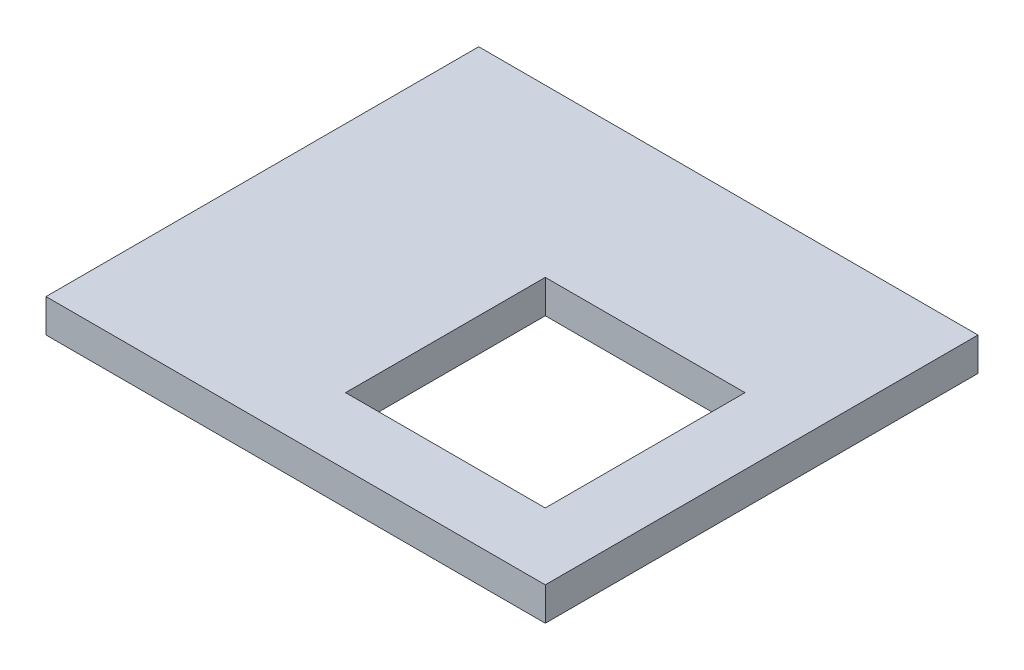
ISO-10303-21;
HEADER;
FILE_DESCRIPTION(('STEP AP214'),'2;1');
FILE_NAME('part.step','',(''),(''),'','','');
FILE_SCHEMA(('AUTOMOTIVE_DESIGN { 1 0 10303 214 1 1 1 1 }'));
ENDSEC;
DATA;
#1=APPLICATION_CONTEXT('core data for automotive mechanical design processes');
#2=APPLICATION_PROTOCOL_DEFINITION('international standard','automotive_design',2000,#1);
#3=PRODUCT_CONTEXT('',#1,'mechanical');
#4=PRODUCT('Part','Part','',(#3));
#5=PRODUCT_RELATED_PRODUCT_CATEGORY('part','',(#4));
#6=PRODUCT_DEFINITION_FORMATION('','',#4);
#7=PRODUCT_DEFINITION_CONTEXT('part definition',#1,'design');
#8=PRODUCT_DEFINITION('design','',#6,#7);
#9=PRODUCT_DEFINITION_SHAPE('','',#8);
#10=(LENGTH_UNIT() NAMED_UNIT(*) SI_UNIT(.MILLI.,.METRE.));
#11=(NAMED_UNIT(*) PLANE_ANGLE_UNIT() SI_UNIT($,.RADIAN.));
#12=(NAMED_UNIT(*) SI_UNIT($,.STERADIAN.) SOLID_ANGLE_UNIT());
#13=UNCERTAINTY_MEASURE_WITH_UNIT(LENGTH_MEASURE(1.E-05),#10,'distance_accuracy_value','');
#14=(GEOMETRIC_REPRESENTATION_CONTEXT(3) GLOBAL_UNCERTAINTY_ASSIGNED_CONTEXT((#13)) GLOBAL_UNIT_ASSIGNED_CONTEXT((#10,
#11,#12)) REPRESENTATION_CONTEXT('',''));
#15=CARTESIAN_POINT('',(0.,0.,0.));
#16=DIRECTION('',(0.,0.,1.));
#17=DIRECTION('',(1.,0.,0.));
#18=AXIS2_PLACEMENT_3D('',#15,#16,#17);
#19=CARTESIAN_POINT('',(0.,5.,0.));
#20=DIRECTION('',(0.,1.,0.));
#21=DIRECTION('',(0.,0.,1.));
#22=AXIS2_PLACEMENT_3D('',#19,#20,#21);
#23=PLANE('',#22);
#24=DIRECTION('',(0.,0.,1.));
#25=VECTOR('',#24,1.);
#26=CARTESIAN_POINT('',(-7.5,5.,6.5));
#27=LINE('',#26,#25);
#28=CARTESIAN_POINT('',(-7.5,5.,-6.5));
#29=VERTEX_POINT('',#28);
#30=CARTESIAN_POINT('',(-7.5,5.,6.5));
#31=VERTEX_POINT('',#30);
#32=EDGE_CURVE('E135',#29,#31,#27,.T.);
#33=ORIENTED_EDGE('',*,*,#32,.T.);
#34=DIRECTION('',(1.,0.,0.));
#35=VECTOR('',#34,1.);
#36=CARTESIAN_POINT('',(7.5,5.,6.5));
#37=LINE('',#36,#35);
#38=CARTESIAN_POINT('',(7.5,5.,6.5));
#39=VERTEX_POINT('',#38);
#40=EDGE_CURVE('E138',#31,#39,#37,.T.);
#41=ORIENTED_EDGE('',*,*,#40,.T.);
#42=DIRECTION('',(0.,0.,-1.));
#43=VECTOR('',#42,1.);
#44=CARTESIAN_POINT('',(7.5,5.,6.5));
#45=LINE('',#44,#43);
#46=CARTESIAN_POINT('',(7.5,5.,-6.5));
#47=VERTEX_POINT('',#46);
#48=EDGE_CURVE('E141',#39,#47,#45,.T.);
#49=ORIENTED_EDGE('',*,*,#48,.T.);
#50=DIRECTION('',(-1.,0.,0.));
#51=VECTOR('',#50,1.);
#52=CARTESIAN_POINT('',(7.5,5.,-6.5));
#53=LINE('',#52,#51);
#54=EDGE_CURVE('E143',#47,#29,#53,.T.);
#55=ORIENTED_EDGE('',*,*,#54,.T.);
#56=EDGE_LOOP('',(#33,#41,#49,#55));
#57=FACE_BOUND('',#56,.T.);
#58=DIRECTION('',(1.,0.,0.));
#59=VECTOR('',#58,1.);
#60=CARTESIAN_POINT('',(0.,5.,-1.5));
#61=LINE('',#60,#59);
#62=CARTESIAN_POINT('',(-0.500000000000001,5.,-1.5));
#63=VERTEX_POINT('',#62);
#64=CARTESIAN_POINT('',(5.5,5.,-1.5));
#65=VERTEX_POINT('',#64);
#66=EDGE_CURVE('E107',#63,#65,#61,.T.);
#67=ORIENTED_EDGE('',*,*,#66,.T.);
#68=DIRECTION('',(0.,0.,1.));
#69=VECTOR('',#68,1.);
#70=CARTESIAN_POINT('',(5.5,5.,0.));
#71=LINE('',#70,#69);
#72=CARTESIAN_POINT('',(5.5,5.,4.5));
#73=VERTEX_POINT('',#72);
#74=EDGE_CURVE('E48',#65,#73,#71,.T.);
#75=ORIENTED_EDGE('',*,*,#74,.T.);
#76=DIRECTION('',(-1.,0.,0.));
#77=VECTOR('',#76,1.);
#78=CARTESIAN_POINT('',(0.,5.,4.5));
#79=LINE('',#78,#77);
#80=CARTESIAN_POINT('',(-0.500000000000001,5.,4.5));
#81=VERTEX_POINT('',#80);
#82=EDGE_CURVE('E113',#73,#81,#79,.T.);
#83=ORIENTED_EDGE('',*,*,#82,.T.);
#84=DIRECTION('',(0.,0.,-1.));
#85=VECTOR('',#84,1.);
#86=CARTESIAN_POINT('',(-0.500000000000001,5.,0.));
#87=LINE('',#86,#85);
#88=EDGE_CURVE('E127',#81,#63,#87,.T.);
#89=ORIENTED_EDGE('',*,*,#88,.T.);
#90=EDGE_LOOP('',(#67,#75,#83,#89));
#91=FACE_BOUND('',#90,.T.);
#92=ADVANCED_FACE('F33',(#57,#91),#23,.T.);
#93=CARTESIAN_POINT('',(0.,4.,0.));
#94=DIRECTION('',(0.,1.,0.));
#95=DIRECTION('',(0.,0.,1.));
#96=AXIS2_PLACEMENT_3D('',#93,#94,#95);
#97=PLANE('',#96);
#98=DIRECTION('',(0.,0.,1.));
#99=VECTOR('',#98,1.);
#100=CARTESIAN_POINT('',(-7.5,4.,6.5));
#101=LINE('',#100,#99);
#102=CARTESIAN_POINT('',(-7.5,4.,-6.5));
#103=VERTEX_POINT('',#102);
#104=CARTESIAN_POINT('',(-7.5,4.,6.5));
#105=VERTEX_POINT('',#104);
#106=EDGE_CURVE('E114',#103,#105,#101,.T.);
#107=ORIENTED_EDGE('',*,*,#106,.F.);
#108=DIRECTION('',(-1.,0.,0.));
#109=VECTOR('',#108,1.);
#110=CARTESIAN_POINT('',(7.5,4.,-6.5));
#111=LINE('',#110,#109);
#112=CARTESIAN_POINT('',(7.5,4.,-6.5));
#113=VERTEX_POINT('',#112);
#114=EDGE_CURVE('E139',#113,#103,#111,.T.);
#115=ORIENTED_EDGE('',*,*,#114,.F.);
#116=DIRECTION('',(0.,0.,-1.));
#117=VECTOR('',#116,1.);
#118=CARTESIAN_POINT('',(7.5,4.,6.5));
#119=LINE('',#118,#117);
#120=CARTESIAN_POINT('',(7.5,4.,6.5));
#121=VERTEX_POINT('',#120);
#122=EDGE_CURVE('E150',#121,#113,#119,.T.);
#123=ORIENTED_EDGE('',*,*,#122,.F.);
#124=DIRECTION('',(1.,0.,0.));
#125=VECTOR('',#124,1.);
#126=CARTESIAN_POINT('',(7.5,4.,6.5));
#127=LINE('',#126,#125);
#128=EDGE_CURVE('E148',#105,#121,#127,.T.);
#129=ORIENTED_EDGE('',*,*,#128,.F.);
#130=EDGE_LOOP('',(#107,#115,#123,#129));
#131=FACE_BOUND('',#130,.T.);
#132=DIRECTION('',(0.,0.,1.));
#133=VECTOR('',#132,1.);
#134=CARTESIAN_POINT('',(5.5,4.,0.));
#135=LINE('',#134,#133);
#136=CARTESIAN_POINT('',(5.5,4.,-1.5));
#137=VERTEX_POINT('',#136);
#138=CARTESIAN_POINT('',(5.5,4.,4.5));
#139=VERTEX_POINT('',#138);
#140=EDGE_CURVE('E98',#137,#139,#135,.T.);
#141=ORIENTED_EDGE('',*,*,#140,.F.);
#142=DIRECTION('',(1.,0.,0.));
#143=VECTOR('',#142,1.);
#144=CARTESIAN_POINT('',(0.,4.,-1.5));
#145=LINE('',#144,#143);
#146=CARTESIAN_POINT('',(-0.500000000000001,4.,-1.5));
#147=VERTEX_POINT('',#146);
#148=EDGE_CURVE('E121',#147,#137,#145,.T.);
#149=ORIENTED_EDGE('',*,*,#148,.F.);
#150=DIRECTION('',(0.,0.,-1.));
#151=VECTOR('',#150,1.);
#152=CARTESIAN_POINT('',(-0.500000000000001,4.,0.));
#153=LINE('',#152,#151);
#154=CARTESIAN_POINT('',(-0.500000000000001,4.,4.5));
#155=VERTEX_POINT('',#154);
#156=EDGE_CURVE('E119',#155,#147,#153,.T.);
#157=ORIENTED_EDGE('',*,*,#156,.F.);
#158=DIRECTION('',(-1.,0.,0.));
#159=VECTOR('',#158,1.);
#160=CARTESIAN_POINT('',(0.,4.,4.5));
#161=LINE('',#160,#159);
#162=EDGE_CURVE('E106',#139,#155,#161,.T.);
#163=ORIENTED_EDGE('',*,*,#162,.F.);
#164=EDGE_LOOP('',(#141,#149,#157,#163));
#165=FACE_BOUND('',#164,.T.);
#166=ADVANCED_FACE('F118',(#131,#165),#97,.F.);
#167=CARTESIAN_POINT('',(-7.5,5.,6.5));
#168=DIRECTION('',(1.,0.,0.));
#169=DIRECTION('',(0.,0.,-1.));
#170=AXIS2_PLACEMENT_3D('',#167,#168,#169);
#171=PLANE('',#170);
#172=ORIENTED_EDGE('',*,*,#106,.T.);
#173=DIRECTION('',(0.,-1.,0.));
#174=VECTOR('',#173,1.);
#175=CARTESIAN_POINT('',(-7.5,5.,6.5));
#176=LINE('',#175,#174);
#177=EDGE_CURVE('E11',#31,#105,#176,.T.);
#178=ORIENTED_EDGE('',*,*,#177,.F.);
#179=ORIENTED_EDGE('',*,*,#32,.F.);
#180=DIRECTION('',(0.,-1.,0.));
#181=VECTOR('',#180,1.);
#182=CARTESIAN_POINT('',(-7.5,5.,-6.5));
#183=LINE('',#182,#181);
#184=EDGE_CURVE('E145',#29,#103,#183,.T.);
#185=ORIENTED_EDGE('',*,*,#184,.T.);
#186=EDGE_LOOP('',(#172,#178,#179,#185));
#187=FACE_BOUND('',#186,.T.);
#188=ADVANCED_FACE('F35',(#187),#171,.F.);
#189=CARTESIAN_POINT('',(7.5,5.,6.5));
#190=DIRECTION('',(0.,0.,-1.));
#191=DIRECTION('',(-1.,0.,0.));
#192=AXIS2_PLACEMENT_3D('',#189,#190,#191);
#193=PLANE('',#192);
#194=ORIENTED_EDGE('',*,*,#128,.T.);
#195=DIRECTION('',(0.,-1.,0.));
#196=VECTOR('',#195,1.);
#197=CARTESIAN_POINT('',(7.5,5.,6.5));
#198=LINE('',#197,#196);
#199=EDGE_CURVE('E41',#39,#121,#198,.T.);
#200=ORIENTED_EDGE('',*,*,#199,.F.);
#201=ORIENTED_EDGE('',*,*,#40,.F.);
#202=ORIENTED_EDGE('',*,*,#177,.T.);
#203=EDGE_LOOP('',(#194,#200,#201,#202));
#204=FACE_BOUND('',#203,.T.);
#205=ADVANCED_FACE('F177',(#204),#193,.F.);
#206=CARTESIAN_POINT('',(7.5,5.,6.5));
#207=DIRECTION('',(-1.,0.,0.));
#208=DIRECTION('',(0.,0.,1.));
#209=AXIS2_PLACEMENT_3D('',#206,#207,#208);
#210=PLANE('',#209);
#211=ORIENTED_EDGE('',*,*,#122,.T.);
#212=DIRECTION('',(0.,-1.,0.));
#213=VECTOR('',#212,1.);
#214=CARTESIAN_POINT('',(7.5,5.,-6.5));
#215=LINE('',#214,#213);
#216=EDGE_CURVE('E155',#47,#113,#215,.T.);
#217=ORIENTED_EDGE('',*,*,#216,.F.);
#218=ORIENTED_EDGE('',*,*,#48,.F.);
#219=ORIENTED_EDGE('',*,*,#199,.T.);
#220=EDGE_LOOP('',(#211,#217,#218,#219));
#221=FACE_BOUND('',#220,.T.);
#222=ADVANCED_FACE('F162',(#221),#210,.F.);
#223=CARTESIAN_POINT('',(7.5,5.,-6.5));
#224=DIRECTION('',(0.,0.,1.));
#225=DIRECTION('',(1.,0.,0.));
#226=AXIS2_PLACEMENT_3D('',#223,#224,#225);
#227=PLANE('',#226);
#228=ORIENTED_EDGE('',*,*,#114,.T.);
#229=ORIENTED_EDGE('',*,*,#184,.F.);
#230=ORIENTED_EDGE('',*,*,#54,.F.);
#231=ORIENTED_EDGE('',*,*,#216,.T.);
#232=EDGE_LOOP('',(#228,#229,#230,#231));
#233=FACE_BOUND('',#232,.T.);
#234=ADVANCED_FACE('F170',(#233),#227,.F.);
#235=CARTESIAN_POINT('',(5.5,4.,0.));
#236=DIRECTION('',(-1.,0.,0.));
#237=DIRECTION('',(0.,0.,1.));
#238=AXIS2_PLACEMENT_3D('',#235,#236,#237);
#239=PLANE('',#238);
#240=ORIENTED_EDGE('',*,*,#74,.F.);
#241=DIRECTION('',(0.,1.,0.));
#242=VECTOR('',#241,1.);
#243=CARTESIAN_POINT('',(5.5,4.,-1.5));
#244=LINE('',#243,#242);
#245=EDGE_CURVE('E102',#137,#65,#244,.T.);
#246=ORIENTED_EDGE('',*,*,#245,.F.);
#247=ORIENTED_EDGE('',*,*,#140,.T.);
#248=DIRECTION('',(0.,1.,0.));
#249=VECTOR('',#248,1.);
#250=CARTESIAN_POINT('',(5.5,4.,4.5));
#251=LINE('',#250,#249);
#252=EDGE_CURVE('E101',#139,#73,#251,.T.);
#253=ORIENTED_EDGE('',*,*,#252,.T.);
#254=EDGE_LOOP('',(#240,#246,#247,#253));
#255=FACE_BOUND('',#254,.T.);
#256=ADVANCED_FACE('F100',(#255),#239,.T.);
#257=CARTESIAN_POINT('',(0.,4.,4.5));
#258=DIRECTION('',(0.,0.,-1.));
#259=DIRECTION('',(-1.,0.,0.));
#260=AXIS2_PLACEMENT_3D('',#257,#258,#259);
#261=PLANE('',#260);
#262=ORIENTED_EDGE('',*,*,#82,.F.);
#263=ORIENTED_EDGE('',*,*,#252,.F.);
#264=ORIENTED_EDGE('',*,*,#162,.T.);
#265=DIRECTION('',(0.,1.,0.));
#266=VECTOR('',#265,1.);
#267=CARTESIAN_POINT('',(-0.500000000000001,4.,4.5));
#268=LINE('',#267,#266);
#269=EDGE_CURVE('E115',#155,#81,#268,.T.);
#270=ORIENTED_EDGE('',*,*,#269,.T.);
#271=EDGE_LOOP('',(#262,#263,#264,#270));
#272=FACE_BOUND('',#271,.T.);
#273=ADVANCED_FACE('F110',(#272),#261,.T.);
#274=CARTESIAN_POINT('',(-0.500000000000001,4.,0.));
#275=DIRECTION('',(1.,0.,0.));
#276=DIRECTION('',(0.,0.,-1.));
#277=AXIS2_PLACEMENT_3D('',#274,#275,#276);
#278=PLANE('',#277);
#279=ORIENTED_EDGE('',*,*,#88,.F.);
#280=ORIENTED_EDGE('',*,*,#269,.F.);
#281=ORIENTED_EDGE('',*,*,#156,.T.);
#282=DIRECTION('',(0.,1.,0.));
#283=VECTOR('',#282,1.);
#284=CARTESIAN_POINT('',(-0.500000000000001,4.,-1.5));
#285=LINE('',#284,#283);
#286=EDGE_CURVE('E56',#147,#63,#285,.T.);
#287=ORIENTED_EDGE('',*,*,#286,.T.);
#288=EDGE_LOOP('',(#279,#280,#281,#287));
#289=FACE_BOUND('',#288,.T.);
#290=ADVANCED_FACE('F200',(#289),#278,.T.);
#291=CARTESIAN_POINT('',(0.,4.,-1.5));
#292=DIRECTION('',(0.,0.,1.));
#293=DIRECTION('',(1.,0.,0.));
#294=AXIS2_PLACEMENT_3D('',#291,#292,#293);
#295=PLANE('',#294);
#296=ORIENTED_EDGE('',*,*,#66,.F.);
#297=ORIENTED_EDGE('',*,*,#286,.F.);
#298=ORIENTED_EDGE('',*,*,#148,.T.);
#299=ORIENTED_EDGE('',*,*,#245,.T.);
#300=EDGE_LOOP('',(#296,#297,#298,#299));
#301=FACE_BOUND('',#300,.T.);
#302=ADVANCED_FACE('F204',(#301),#295,.T.);
#303=CLOSED_SHELL('',(#92,#166,#188,#205,#222,#234,#256,#273,#290,#302));
#304=MANIFOLD_SOLID_BREP('B2',#303);
#305=ADVANCED_BREP_SHAPE_REPRESENTATION('',(#18,#304),#14);
#306=SHAPE_DEFINITION_REPRESENTATION(#9,#305);
ENDSEC;
END-ISO-10303-21;
